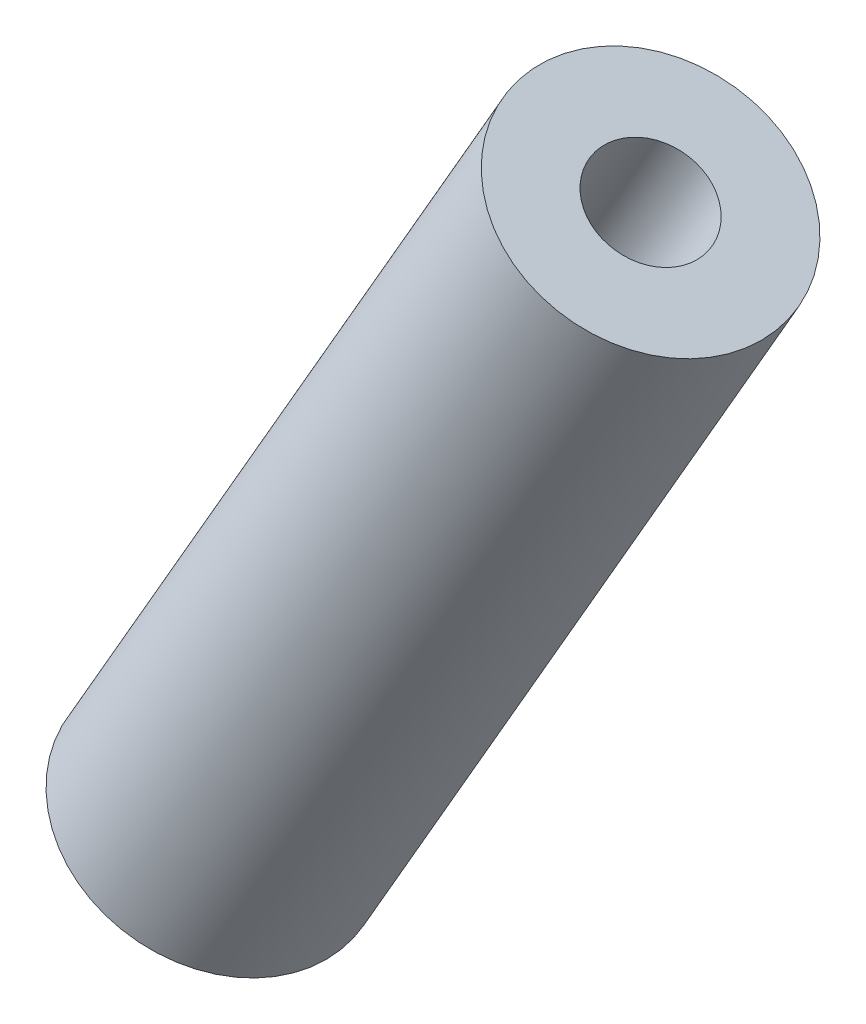
ISO-10303-21;
HEADER;
FILE_DESCRIPTION(('STEP AP214'),'2;1');
FILE_NAME('part.step','',(''),(''),'','','');
FILE_SCHEMA(('AUTOMOTIVE_DESIGN { 1 0 10303 214 1 1 1 1 }'));
ENDSEC;
DATA;
#1=APPLICATION_CONTEXT('core data for automotive mechanical design processes');
#2=APPLICATION_PROTOCOL_DEFINITION('international standard','automotive_design',2000,#1);
#3=PRODUCT_CONTEXT('',#1,'mechanical');
#4=PRODUCT('Part','Part','',(#3));
#5=PRODUCT_RELATED_PRODUCT_CATEGORY('part','',(#4));
#6=PRODUCT_DEFINITION_FORMATION('','',#4);
#7=PRODUCT_DEFINITION_CONTEXT('part definition',#1,'design');
#8=PRODUCT_DEFINITION('design','',#6,#7);
#9=PRODUCT_DEFINITION_SHAPE('','',#8);
#10=(LENGTH_UNIT() NAMED_UNIT(*) SI_UNIT(.MILLI.,.METRE.));
#11=(NAMED_UNIT(*) PLANE_ANGLE_UNIT() SI_UNIT($,.RADIAN.));
#12=(NAMED_UNIT(*) SI_UNIT($,.STERADIAN.) SOLID_ANGLE_UNIT());
#13=UNCERTAINTY_MEASURE_WITH_UNIT(LENGTH_MEASURE(1.E-05),#10,'distance_accuracy_value','');
#14=(GEOMETRIC_REPRESENTATION_CONTEXT(3) GLOBAL_UNCERTAINTY_ASSIGNED_CONTEXT((#13)) GLOBAL_UNIT_ASSIGNED_CONTEXT((#10,
#11,#12)) REPRESENTATION_CONTEXT('',''));
#15=CARTESIAN_POINT('',(0.,0.,0.));
#16=DIRECTION('',(0.,0.,1.));
#17=DIRECTION('',(1.,0.,0.));
#18=AXIS2_PLACEMENT_3D('',#15,#16,#17);
#19=CARTESIAN_POINT('',(225.000000545095,537.428201403832,-362.357302301474));
#20=DIRECTION('',(-0.500000000000003,-0.866025403784437,0.));
#21=DIRECTION('',(0.866025403784437,-0.500000000000003,0.));
#22=AXIS2_PLACEMENT_3D('',#19,#20,#21);
#23=CYLINDRICAL_SURFACE('',#22,1.25);
#24=CARTESIAN_POINT('',(219.900820084741,528.596161769536,-362.357302301474));
#25=DIRECTION('',(-0.500000000000003,-0.866025403784437,0.));
#26=DIRECTION('',(0.866025403784437,-0.500000000000003,0.));
#27=AXIS2_PLACEMENT_3D('',#24,#25,#26);
#28=CIRCLE('',#27,1.25);
#29=CARTESIAN_POINT('',(220.983351839471,527.971161769536,-362.357302301474));
#30=VERTEX_POINT('',#29);
#31=EDGE_CURVE('E27',#30,#30,#28,.F.);
#32=ORIENTED_EDGE('',*,*,#31,.F.);
#33=EDGE_LOOP('',(#32));
#34=FACE_BOUND('',#33,.T.);
#35=CARTESIAN_POINT('',(230.099181005449,546.260241038128,-362.357302301474));
#36=DIRECTION('',(-0.500000000000003,-0.866025403784437,0.));
#37=DIRECTION('',(0.866025403784437,-0.500000000000003,0.));
#38=AXIS2_PLACEMENT_3D('',#35,#36,#37);
#39=CIRCLE('',#38,1.25);
#40=CARTESIAN_POINT('',(231.18171276018,545.635241038128,-362.357302301474));
#41=VERTEX_POINT('',#40);
#42=EDGE_CURVE('E18',#41,#41,#39,.T.);
#43=ORIENTED_EDGE('',*,*,#42,.F.);
#44=EDGE_LOOP('',(#43));
#45=FACE_BOUND('',#44,.T.);
#46=ADVANCED_FACE('F15',(#34,#45),#23,.F.);
#47=CARTESIAN_POINT('',(230.099181005449,546.260241038128,-362.357302301473));
#48=DIRECTION('',(0.500000000000003,0.866025403784437,0.));
#49=DIRECTION('',(-0.866025403784437,0.500000000000003,0.));
#50=AXIS2_PLACEMENT_3D('',#47,#48,#49);
#51=PLANE('',#50);
#52=ORIENTED_EDGE('',*,*,#42,.T.);
#53=EDGE_LOOP('',(#52));
#54=FACE_BOUND('',#53,.T.);
#55=CARTESIAN_POINT('',(230.099181005449,546.260241038127,-362.357302301474));
#56=DIRECTION('',(-0.500000000000003,-0.866025403784437,0.));
#57=DIRECTION('',(0.866025403784437,-0.500000000000003,0.));
#58=AXIS2_PLACEMENT_3D('',#55,#56,#57);
#59=CIRCLE('',#58,3.);
#60=CARTESIAN_POINT('',(232.697257216802,544.760241038127,-362.357302301474));
#61=VERTEX_POINT('',#60);
#62=EDGE_CURVE('E22',#61,#61,#59,.T.);
#63=ORIENTED_EDGE('',*,*,#62,.F.);
#64=EDGE_LOOP('',(#63));
#65=FACE_BOUND('',#64,.T.);
#66=ADVANCED_FACE('F35',(#54,#65),#51,.T.);
#67=CARTESIAN_POINT('',(219.900820084741,528.596161769536,-362.357302301474));
#68=DIRECTION('',(-0.500000000000003,-0.866025403784437,0.));
#69=DIRECTION('',(0.866025403784437,-0.500000000000003,0.));
#70=AXIS2_PLACEMENT_3D('',#67,#68,#69);
#71=PLANE('',#70);
#72=ORIENTED_EDGE('',*,*,#31,.T.);
#73=EDGE_LOOP('',(#72));
#74=FACE_BOUND('',#73,.T.);
#75=CARTESIAN_POINT('',(219.900820084741,528.596161769536,-362.357302301474));
#76=DIRECTION('',(-0.500000000000003,-0.866025403784437,0.));
#77=DIRECTION('',(0.866025403784437,-0.500000000000003,0.));
#78=AXIS2_PLACEMENT_3D('',#75,#76,#77);
#79=CIRCLE('',#78,3.);
#80=CARTESIAN_POINT('',(222.498896296094,527.096161769536,-362.357302301474));
#81=VERTEX_POINT('',#80);
#82=EDGE_CURVE('E10',#81,#81,#79,.F.);
#83=ORIENTED_EDGE('',*,*,#82,.F.);
#84=EDGE_LOOP('',(#83));
#85=FACE_BOUND('',#84,.T.);
#86=ADVANCED_FACE('F44',(#74,#85),#71,.T.);
#87=CARTESIAN_POINT('',(225.000000545095,537.428201403832,-362.357302301474));
#88=DIRECTION('',(-0.500000000000003,-0.866025403784437,0.));
#89=DIRECTION('',(0.866025403784437,-0.500000000000003,0.));
#90=AXIS2_PLACEMENT_3D('',#87,#88,#89);
#91=CYLINDRICAL_SURFACE('',#90,3.);
#92=ORIENTED_EDGE('',*,*,#62,.T.);
#93=EDGE_LOOP('',(#92));
#94=FACE_BOUND('',#93,.T.);
#95=ORIENTED_EDGE('',*,*,#82,.T.);
#96=EDGE_LOOP('',(#95));
#97=FACE_BOUND('',#96,.T.);
#98=ADVANCED_FACE('F45',(#94,#97),#91,.T.);
#99=CLOSED_SHELL('',(#46,#66,#86,#98));
#100=MANIFOLD_SOLID_BREP('B1',#99);
#101=ADVANCED_BREP_SHAPE_REPRESENTATION('',(#18,#100),#14);
#102=SHAPE_DEFINITION_REPRESENTATION(#9,#101);
ENDSEC;
END-ISO-10303-21;
